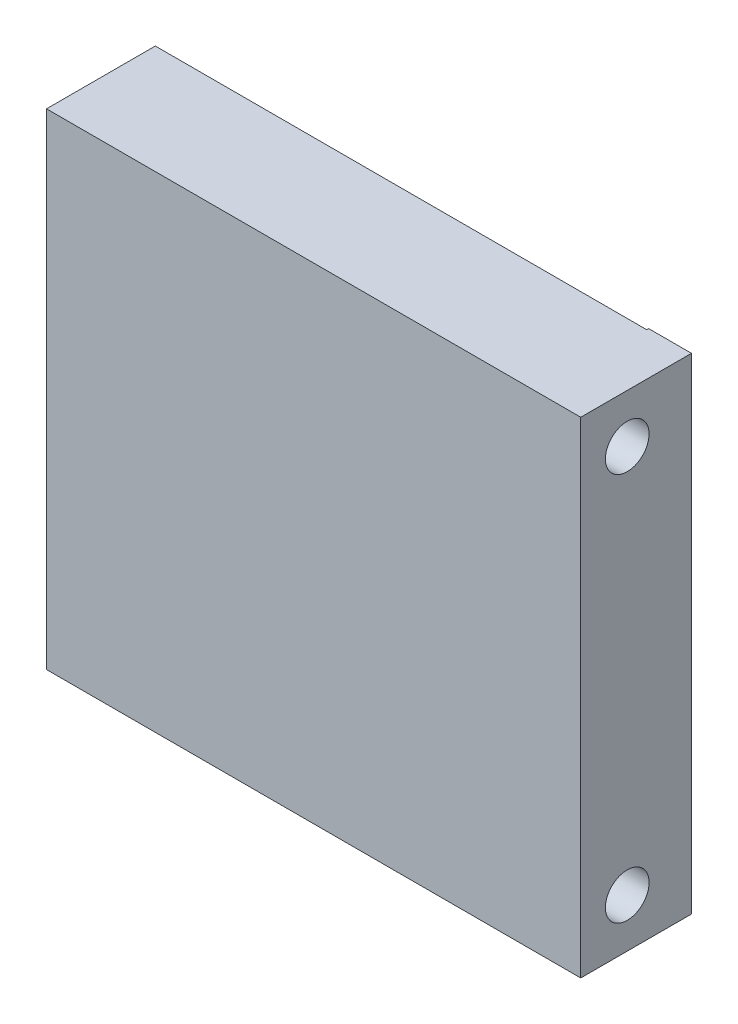
ISO-10303-21;
HEADER;
FILE_DESCRIPTION(('STEP AP214'),'2;1');
FILE_NAME('part.step','',(''),(''),'','','');
FILE_SCHEMA(('AUTOMOTIVE_DESIGN { 1 0 10303 214 1 1 1 1 }'));
ENDSEC;
DATA;
#1=APPLICATION_CONTEXT('core data for automotive mechanical design processes');
#2=APPLICATION_PROTOCOL_DEFINITION('international standard','automotive_design',2000,#1);
#3=PRODUCT_CONTEXT('',#1,'mechanical');
#4=PRODUCT('Part','Part','',(#3));
#5=PRODUCT_RELATED_PRODUCT_CATEGORY('part','',(#4));
#6=PRODUCT_DEFINITION_FORMATION('','',#4);
#7=PRODUCT_DEFINITION_CONTEXT('part definition',#1,'design');
#8=PRODUCT_DEFINITION('design','',#6,#7);
#9=PRODUCT_DEFINITION_SHAPE('','',#8);
#10=(LENGTH_UNIT() NAMED_UNIT(*) SI_UNIT(.MILLI.,.METRE.));
#11=(NAMED_UNIT(*) PLANE_ANGLE_UNIT() SI_UNIT($,.RADIAN.));
#12=(NAMED_UNIT(*) SI_UNIT($,.STERADIAN.) SOLID_ANGLE_UNIT());
#13=UNCERTAINTY_MEASURE_WITH_UNIT(LENGTH_MEASURE(1.E-05),#10,'distance_accuracy_value','');
#14=(GEOMETRIC_REPRESENTATION_CONTEXT(3) GLOBAL_UNCERTAINTY_ASSIGNED_CONTEXT((#13)) GLOBAL_UNIT_ASSIGNED_CONTEXT((#10,
#11,#12)) REPRESENTATION_CONTEXT('',''));
#15=CARTESIAN_POINT('',(0.,0.,0.));
#16=DIRECTION('',(0.,0.,1.));
#17=DIRECTION('',(1.,0.,0.));
#18=AXIS2_PLACEMENT_3D('',#15,#16,#17);
#19=CARTESIAN_POINT('',(25.3,0.,0.));
#20=DIRECTION('',(-1.,0.,0.));
#21=DIRECTION('',(0.,0.,1.));
#22=AXIS2_PLACEMENT_3D('',#19,#20,#21);
#23=PLANE('',#22);
#24=DIRECTION('',(0.,0.,1.));
#25=VECTOR('',#24,1.);
#26=CARTESIAN_POINT('',(25.3,20.5,-8.2));
#27=LINE('',#26,#25);
#28=CARTESIAN_POINT('',(25.3,20.5,-8.2));
#29=VERTEX_POINT('',#28);
#30=CARTESIAN_POINT('',(25.3,20.5,-6.4));
#31=VERTEX_POINT('',#30);
#32=EDGE_CURVE('E200',#29,#31,#27,.T.);
#33=ORIENTED_EDGE('',*,*,#32,.F.);
#34=DIRECTION('',(0.,-1.,0.));
#35=VECTOR('',#34,1.);
#36=CARTESIAN_POINT('',(25.3,19.5,-8.2));
#37=LINE('',#36,#35);
#38=CARTESIAN_POINT('',(25.3,19.5,-8.2));
#39=VERTEX_POINT('',#38);
#40=EDGE_CURVE('E11',#29,#39,#37,.T.);
#41=ORIENTED_EDGE('',*,*,#40,.T.);
#42=DIRECTION('',(0.,0.,1.));
#43=VECTOR('',#42,1.);
#44=CARTESIAN_POINT('',(25.3,19.5,-10.2));
#45=LINE('',#44,#43);
#46=CARTESIAN_POINT('',(25.3,19.5,-10.2));
#47=VERTEX_POINT('',#46);
#48=EDGE_CURVE('E198',#47,#39,#45,.T.);
#49=ORIENTED_EDGE('',*,*,#48,.F.);
#50=DIRECTION('',(0.,-1.,0.));
#51=VECTOR('',#50,1.);
#52=CARTESIAN_POINT('',(25.3,19.5,-10.2));
#53=LINE('',#52,#51);
#54=CARTESIAN_POINT('',(25.3,25.,-10.2));
#55=VERTEX_POINT('',#54);
#56=EDGE_CURVE('E194',#55,#47,#53,.T.);
#57=ORIENTED_EDGE('',*,*,#56,.F.);
#58=DIRECTION('',(0.,0.,1.));
#59=VECTOR('',#58,1.);
#60=CARTESIAN_POINT('',(25.3,25.,1.));
#61=LINE('',#60,#59);
#62=CARTESIAN_POINT('',(25.3,25.,-10.4));
#63=VERTEX_POINT('',#62);
#64=EDGE_CURVE('E284',#63,#55,#61,.T.);
#65=ORIENTED_EDGE('',*,*,#64,.F.);
#66=DIRECTION('',(0.,1.,0.));
#67=VECTOR('',#66,1.);
#68=CARTESIAN_POINT('',(25.3,25.,-10.4));
#69=LINE('',#68,#67);
#70=CARTESIAN_POINT('',(25.3,-25.,-10.4));
#71=VERTEX_POINT('',#70);
#72=EDGE_CURVE('E298',#71,#63,#69,.T.);
#73=ORIENTED_EDGE('',*,*,#72,.F.);
#74=DIRECTION('',(0.,0.,-1.));
#75=VECTOR('',#74,1.);
#76=CARTESIAN_POINT('',(25.3,-25.,1.));
#77=LINE('',#76,#75);
#78=CARTESIAN_POINT('',(25.3,-25.,-10.2));
#79=VERTEX_POINT('',#78);
#80=EDGE_CURVE('E306',#79,#71,#77,.T.);
#81=ORIENTED_EDGE('',*,*,#80,.F.);
#82=DIRECTION('',(0.,-1.,0.));
#83=VECTOR('',#82,1.);
#84=CARTESIAN_POINT('',(25.3,-25.,-10.2));
#85=LINE('',#84,#83);
#86=CARTESIAN_POINT('',(25.3,-19.5,-10.2));
#87=VERTEX_POINT('',#86);
#88=EDGE_CURVE('E219',#87,#79,#85,.T.);
#89=ORIENTED_EDGE('',*,*,#88,.F.);
#90=DIRECTION('',(0.,0.,1.));
#91=VECTOR('',#90,1.);
#92=CARTESIAN_POINT('',(25.3,-19.5,-10.2));
#93=LINE('',#92,#91);
#94=CARTESIAN_POINT('',(25.3,-19.5,-8.2));
#95=VERTEX_POINT('',#94);
#96=EDGE_CURVE('E209',#87,#95,#93,.T.);
#97=ORIENTED_EDGE('',*,*,#96,.T.);
#98=DIRECTION('',(0.,-1.,0.));
#99=VECTOR('',#98,1.);
#100=CARTESIAN_POINT('',(25.3,-25.,-8.2));
#101=LINE('',#100,#99);
#102=CARTESIAN_POINT('',(25.3,-20.5,-8.2));
#103=VERTEX_POINT('',#102);
#104=EDGE_CURVE('E65',#95,#103,#101,.T.);
#105=ORIENTED_EDGE('',*,*,#104,.T.);
#106=DIRECTION('',(0.,0.,1.));
#107=VECTOR('',#106,1.);
#108=CARTESIAN_POINT('',(25.3,-20.5,-8.2));
#109=LINE('',#108,#107);
#110=CARTESIAN_POINT('',(25.3,-20.5,-6.4));
#111=VERTEX_POINT('',#110);
#112=EDGE_CURVE('E236',#103,#111,#109,.T.);
#113=ORIENTED_EDGE('',*,*,#112,.T.);
#114=DIRECTION('',(0.,-1.,0.));
#115=VECTOR('',#114,1.);
#116=CARTESIAN_POINT('',(25.3,-25.,-6.4));
#117=LINE('',#116,#115);
#118=CARTESIAN_POINT('',(25.3,-19.5,-6.4));
#119=VERTEX_POINT('',#118);
#120=EDGE_CURVE('E267',#119,#111,#117,.T.);
#121=ORIENTED_EDGE('',*,*,#120,.F.);
#122=DIRECTION('',(0.,0.,1.));
#123=VECTOR('',#122,1.);
#124=CARTESIAN_POINT('',(25.3,-19.5,-6.4));
#125=LINE('',#124,#123);
#126=CARTESIAN_POINT('',(25.3,-19.5,-5.98088013202861));
#127=VERTEX_POINT('',#126);
#128=EDGE_CURVE('E270',#119,#127,#125,.T.);
#129=ORIENTED_EDGE('',*,*,#128,.T.);
#130=CARTESIAN_POINT('',(25.3,-20.,-3.78713903518058));
#131=DIRECTION('',(1.,0.,0.));
#132=DIRECTION('',(0.,0.,-1.));
#133=AXIS2_PLACEMENT_3D('',#130,#131,#132);
#134=CIRCLE('',#133,2.25);
#135=CARTESIAN_POINT('',(25.3,-19.5,-1.59339793833255));
#136=VERTEX_POINT('',#135);
#137=EDGE_CURVE('E280',#127,#136,#134,.T.);
#138=ORIENTED_EDGE('',*,*,#137,.T.);
#139=CARTESIAN_POINT('',(25.3,-19.5,0.));
#140=VERTEX_POINT('',#139);
#141=EDGE_CURVE('E268',#136,#140,#125,.T.);
#142=ORIENTED_EDGE('',*,*,#141,.T.);
#143=DIRECTION('',(0.,1.,0.));
#144=VECTOR('',#143,1.);
#145=CARTESIAN_POINT('',(25.3,-25.,0.));
#146=LINE('',#145,#144);
#147=CARTESIAN_POINT('',(25.3,19.5,0.));
#148=VERTEX_POINT('',#147);
#149=EDGE_CURVE('E316',#140,#148,#146,.T.);
#150=ORIENTED_EDGE('',*,*,#149,.T.);
#151=DIRECTION('',(0.,0.,1.));
#152=VECTOR('',#151,1.);
#153=CARTESIAN_POINT('',(25.3,19.5,-6.4));
#154=LINE('',#153,#152);
#155=CARTESIAN_POINT('',(25.3,19.5,-1.59339793833255));
#156=VERTEX_POINT('',#155);
#157=EDGE_CURVE('E258',#156,#148,#154,.T.);
#158=ORIENTED_EDGE('',*,*,#157,.F.);
#159=CARTESIAN_POINT('',(25.3,20.,-3.78713903518058));
#160=DIRECTION('',(1.,0.,0.));
#161=DIRECTION('',(0.,0.,-1.));
#162=AXIS2_PLACEMENT_3D('',#159,#160,#161);
#163=CIRCLE('',#162,2.25);
#164=CARTESIAN_POINT('',(25.3,19.5,-5.98088013202861));
#165=VERTEX_POINT('',#164);
#166=EDGE_CURVE('E289',#156,#165,#163,.T.);
#167=ORIENTED_EDGE('',*,*,#166,.T.);
#168=CARTESIAN_POINT('',(25.3,19.5,-6.4));
#169=VERTEX_POINT('',#168);
#170=EDGE_CURVE('E257',#169,#165,#154,.T.);
#171=ORIENTED_EDGE('',*,*,#170,.F.);
#172=DIRECTION('',(0.,-1.,0.));
#173=VECTOR('',#172,1.);
#174=CARTESIAN_POINT('',(25.3,19.5,-6.4));
#175=LINE('',#174,#173);
#176=EDGE_CURVE('E246',#31,#169,#175,.T.);
#177=ORIENTED_EDGE('',*,*,#176,.F.);
#178=EDGE_LOOP('',(#33,#41,#49,#57,#65,#73,#81,#89,#97,#105,#113,#121,#129,#138,#142,#150,#158,
#167,#171,#177));
#179=FACE_BOUND('',#178,.T.);
#180=ADVANCED_FACE('F39',(#179),#23,.T.);
#181=CARTESIAN_POINT('',(0.,0.,0.));
#182=DIRECTION('',(0.,0.,1.));
#183=DIRECTION('',(1.,0.,0.));
#184=AXIS2_PLACEMENT_3D('',#181,#182,#183);
#185=PLANE('',#184);
#186=DIRECTION('',(-1.,0.,0.));
#187=VECTOR('',#186,1.);
#188=CARTESIAN_POINT('',(-25.3,19.5,0.));
#189=LINE('',#188,#187);
#190=CARTESIAN_POINT('',(-25.3,19.5,0.));
#191=VERTEX_POINT('',#190);
#192=EDGE_CURVE('E248',#148,#191,#189,.T.);
#193=ORIENTED_EDGE('',*,*,#192,.F.);
#194=ORIENTED_EDGE('',*,*,#149,.F.);
#195=DIRECTION('',(1.,0.,0.));
#196=VECTOR('',#195,1.);
#197=CARTESIAN_POINT('',(-25.3,-19.5,0.));
#198=LINE('',#197,#196);
#199=CARTESIAN_POINT('',(-25.3,-19.5,0.));
#200=VERTEX_POINT('',#199);
#201=EDGE_CURVE('E259',#200,#140,#198,.T.);
#202=ORIENTED_EDGE('',*,*,#201,.F.);
#203=DIRECTION('',(0.,-1.,0.));
#204=VECTOR('',#203,1.);
#205=CARTESIAN_POINT('',(-25.3,-25.,0.));
#206=LINE('',#205,#204);
#207=EDGE_CURVE('E313',#191,#200,#206,.T.);
#208=ORIENTED_EDGE('',*,*,#207,.F.);
#209=EDGE_LOOP('',(#193,#194,#202,#208));
#210=FACE_BOUND('',#209,.T.);
#211=ADVANCED_FACE('F383',(#210),#185,.F.);
#212=CARTESIAN_POINT('',(-25.3,25.,1.));
#213=DIRECTION('',(0.,-1.,0.));
#214=DIRECTION('',(1.,0.,0.));
#215=AXIS2_PLACEMENT_3D('',#212,#213,#214);
#216=PLANE('',#215);
#217=DIRECTION('',(1.,0.,0.));
#218=VECTOR('',#217,1.);
#219=CARTESIAN_POINT('',(-25.3,25.,-10.2));
#220=LINE('',#219,#218);
#221=CARTESIAN_POINT('',(-25.3,25.,-10.2));
#222=VERTEX_POINT('',#221);
#223=EDGE_CURVE('E190',#222,#55,#220,.T.);
#224=ORIENTED_EDGE('',*,*,#223,.F.);
#225=DIRECTION('',(0.,0.,-1.));
#226=VECTOR('',#225,1.);
#227=CARTESIAN_POINT('',(-25.3,25.,1.));
#228=LINE('',#227,#226);
#229=CARTESIAN_POINT('',(-25.3,25.,1.));
#230=VERTEX_POINT('',#229);
#231=EDGE_CURVE('E43',#230,#222,#228,.T.);
#232=ORIENTED_EDGE('',*,*,#231,.F.);
#233=DIRECTION('',(-1.,0.,0.));
#234=VECTOR('',#233,1.);
#235=CARTESIAN_POINT('',(-25.3,25.,1.));
#236=LINE('',#235,#234);
#237=CARTESIAN_POINT('',(29.7,25.,1.));
#238=VERTEX_POINT('',#237);
#239=EDGE_CURVE('E314',#238,#230,#236,.T.);
#240=ORIENTED_EDGE('',*,*,#239,.F.);
#241=DIRECTION('',(0.,0.,1.));
#242=VECTOR('',#241,1.);
#243=CARTESIAN_POINT('',(29.7,25.,1.));
#244=LINE('',#243,#242);
#245=CARTESIAN_POINT('',(29.7,25.,-10.4));
#246=VERTEX_POINT('',#245);
#247=EDGE_CURVE('E292',#246,#238,#244,.T.);
#248=ORIENTED_EDGE('',*,*,#247,.F.);
#249=DIRECTION('',(-1.,0.,0.));
#250=VECTOR('',#249,1.);
#251=CARTESIAN_POINT('',(29.7,25.,-10.4));
#252=LINE('',#251,#250);
#253=EDGE_CURVE('E303',#246,#63,#252,.T.);
#254=ORIENTED_EDGE('',*,*,#253,.T.);
#255=ORIENTED_EDGE('',*,*,#64,.T.);
#256=EDGE_LOOP('',(#224,#232,#240,#248,#254,#255));
#257=FACE_BOUND('',#256,.T.);
#258=ADVANCED_FACE('F41',(#257),#216,.F.);
#259=CARTESIAN_POINT('',(-25.3,-25.,1.));
#260=DIRECTION('',(1.,0.,0.));
#261=DIRECTION('',(0.,0.,-1.));
#262=AXIS2_PLACEMENT_3D('',#259,#260,#261);
#263=PLANE('',#262);
#264=ORIENTED_EDGE('',*,*,#231,.T.);
#265=DIRECTION('',(0.,1.,0.));
#266=VECTOR('',#265,1.);
#267=CARTESIAN_POINT('',(-25.3,19.5,-10.2));
#268=LINE('',#267,#266);
#269=CARTESIAN_POINT('',(-25.3,19.5,-10.2));
#270=VERTEX_POINT('',#269);
#271=EDGE_CURVE('E177',#270,#222,#268,.T.);
#272=ORIENTED_EDGE('',*,*,#271,.F.);
#273=DIRECTION('',(0.,0.,1.));
#274=VECTOR('',#273,1.);
#275=CARTESIAN_POINT('',(-25.3,19.5,-10.2));
#276=LINE('',#275,#274);
#277=CARTESIAN_POINT('',(-25.3,19.5,-8.2));
#278=VERTEX_POINT('',#277);
#279=EDGE_CURVE('E185',#270,#278,#276,.T.);
#280=ORIENTED_EDGE('',*,*,#279,.T.);
#281=DIRECTION('',(0.,1.,0.));
#282=VECTOR('',#281,1.);
#283=CARTESIAN_POINT('',(-25.3,19.5,-8.2));
#284=LINE('',#283,#282);
#285=CARTESIAN_POINT('',(-25.3,20.5,-8.2));
#286=VERTEX_POINT('',#285);
#287=EDGE_CURVE('E195',#278,#286,#284,.T.);
#288=ORIENTED_EDGE('',*,*,#287,.T.);
#289=DIRECTION('',(0.,0.,1.));
#290=VECTOR('',#289,1.);
#291=CARTESIAN_POINT('',(-25.3,20.5,-8.2));
#292=LINE('',#291,#290);
#293=CARTESIAN_POINT('',(-25.3,20.5,-6.4));
#294=VERTEX_POINT('',#293);
#295=EDGE_CURVE('E205',#286,#294,#292,.T.);
#296=ORIENTED_EDGE('',*,*,#295,.T.);
#297=DIRECTION('',(0.,1.,0.));
#298=VECTOR('',#297,1.);
#299=CARTESIAN_POINT('',(-25.3,19.5,-6.4));
#300=LINE('',#299,#298);
#301=CARTESIAN_POINT('',(-25.3,19.5,-6.4));
#302=VERTEX_POINT('',#301);
#303=EDGE_CURVE('E252',#302,#294,#300,.T.);
#304=ORIENTED_EDGE('',*,*,#303,.F.);
#305=DIRECTION('',(0.,0.,1.));
#306=VECTOR('',#305,1.);
#307=CARTESIAN_POINT('',(-25.3,19.5,-6.4));
#308=LINE('',#307,#306);
#309=EDGE_CURVE('E254',#302,#191,#308,.T.);
#310=ORIENTED_EDGE('',*,*,#309,.T.);
#311=ORIENTED_EDGE('',*,*,#207,.T.);
#312=DIRECTION('',(0.,0.,1.));
#313=VECTOR('',#312,1.);
#314=CARTESIAN_POINT('',(-25.3,-19.5,-6.4));
#315=LINE('',#314,#313);
#316=CARTESIAN_POINT('',(-25.3,-19.5,-6.4));
#317=VERTEX_POINT('',#316);
#318=EDGE_CURVE('E238',#317,#200,#315,.T.);
#319=ORIENTED_EDGE('',*,*,#318,.F.);
#320=DIRECTION('',(0.,1.,0.));
#321=VECTOR('',#320,1.);
#322=CARTESIAN_POINT('',(-25.3,-25.,-6.4));
#323=LINE('',#322,#321);
#324=CARTESIAN_POINT('',(-25.3,-20.5,-6.4));
#325=VERTEX_POINT('',#324);
#326=EDGE_CURVE('E271',#325,#317,#323,.T.);
#327=ORIENTED_EDGE('',*,*,#326,.F.);
#328=DIRECTION('',(0.,0.,1.));
#329=VECTOR('',#328,1.);
#330=CARTESIAN_POINT('',(-25.3,-20.5,-8.2));
#331=LINE('',#330,#329);
#332=CARTESIAN_POINT('',(-25.3,-20.5,-8.2));
#333=VERTEX_POINT('',#332);
#334=EDGE_CURVE('E230',#333,#325,#331,.T.);
#335=ORIENTED_EDGE('',*,*,#334,.F.);
#336=DIRECTION('',(0.,1.,0.));
#337=VECTOR('',#336,1.);
#338=CARTESIAN_POINT('',(-25.3,-25.,-8.2));
#339=LINE('',#338,#337);
#340=CARTESIAN_POINT('',(-25.3,-19.5,-8.2));
#341=VERTEX_POINT('',#340);
#342=EDGE_CURVE('E212',#333,#341,#339,.T.);
#343=ORIENTED_EDGE('',*,*,#342,.T.);
#344=DIRECTION('',(0.,0.,1.));
#345=VECTOR('',#344,1.);
#346=CARTESIAN_POINT('',(-25.3,-19.5,-10.2));
#347=LINE('',#346,#345);
#348=CARTESIAN_POINT('',(-25.3,-19.5,-10.2));
#349=VERTEX_POINT('',#348);
#350=EDGE_CURVE('E207',#349,#341,#347,.T.);
#351=ORIENTED_EDGE('',*,*,#350,.F.);
#352=DIRECTION('',(0.,1.,0.));
#353=VECTOR('',#352,1.);
#354=CARTESIAN_POINT('',(-25.3,-25.,-10.2));
#355=LINE('',#354,#353);
#356=CARTESIAN_POINT('',(-25.3,-25.,-10.2));
#357=VERTEX_POINT('',#356);
#358=EDGE_CURVE('E217',#357,#349,#355,.T.);
#359=ORIENTED_EDGE('',*,*,#358,.F.);
#360=DIRECTION('',(0.,0.,-1.));
#361=VECTOR('',#360,1.);
#362=CARTESIAN_POINT('',(-25.3,-25.,1.));
#363=LINE('',#362,#361);
#364=CARTESIAN_POINT('',(-25.3,-25.,1.));
#365=VERTEX_POINT('',#364);
#366=EDGE_CURVE('E325',#365,#357,#363,.T.);
#367=ORIENTED_EDGE('',*,*,#366,.F.);
#368=DIRECTION('',(0.,-1.,0.));
#369=VECTOR('',#368,1.);
#370=CARTESIAN_POINT('',(-25.3,19.,1.));
#371=LINE('',#370,#369);
#372=EDGE_CURVE('E319',#230,#365,#371,.T.);
#373=ORIENTED_EDGE('',*,*,#372,.F.);
#374=EDGE_LOOP('',(#264,#272,#280,#288,#296,#304,#310,#311,#319,#327,#335,#343,#351,#359,#367,#373));
#375=FACE_BOUND('',#374,.T.);
#376=ADVANCED_FACE('F179',(#375),#263,.F.);
#377=CARTESIAN_POINT('',(-25.3,-25.,1.));
#378=DIRECTION('',(0.,1.,0.));
#379=DIRECTION('',(-1.,0.,0.));
#380=AXIS2_PLACEMENT_3D('',#377,#378,#379);
#381=PLANE('',#380);
#382=ORIENTED_EDGE('',*,*,#366,.T.);
#383=DIRECTION('',(-1.,0.,0.));
#384=VECTOR('',#383,1.);
#385=CARTESIAN_POINT('',(-25.3,-25.,-10.2));
#386=LINE('',#385,#384);
#387=EDGE_CURVE('E225',#79,#357,#386,.T.);
#388=ORIENTED_EDGE('',*,*,#387,.F.);
#389=ORIENTED_EDGE('',*,*,#80,.T.);
#390=DIRECTION('',(-1.,0.,0.));
#391=VECTOR('',#390,1.);
#392=CARTESIAN_POINT('',(29.7,-25.,-10.4));
#393=LINE('',#392,#391);
#394=CARTESIAN_POINT('',(29.7,-25.,-10.4));
#395=VERTEX_POINT('',#394);
#396=EDGE_CURVE('E311',#395,#71,#393,.T.);
#397=ORIENTED_EDGE('',*,*,#396,.F.);
#398=DIRECTION('',(0.,0.,-1.));
#399=VECTOR('',#398,1.);
#400=CARTESIAN_POINT('',(29.7,-25.,1.));
#401=LINE('',#400,#399);
#402=CARTESIAN_POINT('',(29.7,-25.,1.));
#403=VERTEX_POINT('',#402);
#404=EDGE_CURVE('E299',#403,#395,#401,.T.);
#405=ORIENTED_EDGE('',*,*,#404,.F.);
#406=DIRECTION('',(1.,0.,0.));
#407=VECTOR('',#406,1.);
#408=CARTESIAN_POINT('',(-25.3,-25.,1.));
#409=LINE('',#408,#407);
#410=EDGE_CURVE('E324',#365,#403,#409,.T.);
#411=ORIENTED_EDGE('',*,*,#410,.F.);
#412=EDGE_LOOP('',(#382,#388,#389,#397,#405,#411));
#413=FACE_BOUND('',#412,.T.);
#414=ADVANCED_FACE('F327',(#413),#381,.F.);
#415=CARTESIAN_POINT('',(0.,0.,1.));
#416=DIRECTION('',(0.,0.,1.));
#417=DIRECTION('',(1.,0.,0.));
#418=AXIS2_PLACEMENT_3D('',#415,#416,#417);
#419=PLANE('',#418);
#420=ORIENTED_EDGE('',*,*,#239,.T.);
#421=ORIENTED_EDGE('',*,*,#372,.T.);
#422=ORIENTED_EDGE('',*,*,#410,.T.);
#423=DIRECTION('',(0.,-1.,0.));
#424=VECTOR('',#423,1.);
#425=CARTESIAN_POINT('',(29.7,25.,1.));
#426=LINE('',#425,#424);
#427=EDGE_CURVE('E294',#238,#403,#426,.T.);
#428=ORIENTED_EDGE('',*,*,#427,.F.);
#429=EDGE_LOOP('',(#420,#421,#422,#428));
#430=FACE_BOUND('',#429,.T.);
#431=ADVANCED_FACE('F357',(#430),#419,.T.);
#432=CARTESIAN_POINT('',(29.7,25.,-10.4));
#433=DIRECTION('',(0.,0.,1.));
#434=DIRECTION('',(0.,-1.,0.));
#435=AXIS2_PLACEMENT_3D('',#432,#433,#434);
#436=PLANE('',#435);
#437=ORIENTED_EDGE('',*,*,#72,.T.);
#438=ORIENTED_EDGE('',*,*,#253,.F.);
#439=DIRECTION('',(0.,1.,0.));
#440=VECTOR('',#439,1.);
#441=CARTESIAN_POINT('',(29.7,25.,-10.4));
#442=LINE('',#441,#440);
#443=EDGE_CURVE('E301',#395,#246,#442,.T.);
#444=ORIENTED_EDGE('',*,*,#443,.F.);
#445=ORIENTED_EDGE('',*,*,#396,.T.);
#446=EDGE_LOOP('',(#437,#438,#444,#445));
#447=FACE_BOUND('',#446,.T.);
#448=ADVANCED_FACE('F347',(#447),#436,.F.);
#449=CARTESIAN_POINT('',(29.7,0.,0.));
#450=DIRECTION('',(-1.,0.,0.));
#451=DIRECTION('',(0.,0.,1.));
#452=AXIS2_PLACEMENT_3D('',#449,#450,#451);
#453=PLANE('',#452);
#454=CARTESIAN_POINT('',(29.7,-20.,-3.78713903518058));
#455=DIRECTION('',(1.,0.,0.));
#456=DIRECTION('',(0.,0.,-1.));
#457=AXIS2_PLACEMENT_3D('',#454,#455,#456);
#458=CIRCLE('',#457,2.25);
#459=CARTESIAN_POINT('',(29.7,-20.,-6.03713903518058));
#460=VERTEX_POINT('',#459);
#461=EDGE_CURVE('E285',#460,#460,#458,.T.);
#462=ORIENTED_EDGE('',*,*,#461,.F.);
#463=EDGE_LOOP('',(#462));
#464=FACE_BOUND('',#463,.T.);
#465=CARTESIAN_POINT('',(29.7,20.,-3.78713903518058));
#466=DIRECTION('',(1.,0.,0.));
#467=DIRECTION('',(0.,0.,-1.));
#468=AXIS2_PLACEMENT_3D('',#465,#466,#467);
#469=CIRCLE('',#468,2.25);
#470=CARTESIAN_POINT('',(29.7,20.,-6.03713903518058));
#471=VERTEX_POINT('',#470);
#472=EDGE_CURVE('E288',#471,#471,#469,.T.);
#473=ORIENTED_EDGE('',*,*,#472,.F.);
#474=EDGE_LOOP('',(#473));
#475=FACE_BOUND('',#474,.T.);
#476=ORIENTED_EDGE('',*,*,#247,.T.);
#477=ORIENTED_EDGE('',*,*,#427,.T.);
#478=ORIENTED_EDGE('',*,*,#404,.T.);
#479=ORIENTED_EDGE('',*,*,#443,.T.);
#480=EDGE_LOOP('',(#476,#477,#478,#479));
#481=FACE_BOUND('',#480,.T.);
#482=ADVANCED_FACE('F354',(#464,#475,#481),#453,.F.);
#483=CARTESIAN_POINT('',(25.3,20.,-3.78713903518058));
#484=DIRECTION('',(1.,0.,0.));
#485=DIRECTION('',(0.,0.,-1.));
#486=AXIS2_PLACEMENT_3D('',#483,#484,#485);
#487=CYLINDRICAL_SURFACE('',#486,2.25);
#488=ORIENTED_EDGE('',*,*,#166,.F.);
#489=EDGE_CURVE('E265',#165,#156,#163,.T.);
#490=ORIENTED_EDGE('',*,*,#489,.F.);
#491=EDGE_LOOP('',(#488,#490));
#492=FACE_BOUND('',#491,.T.);
#493=ORIENTED_EDGE('',*,*,#472,.T.);
#494=EDGE_LOOP('',(#493));
#495=FACE_BOUND('',#494,.T.);
#496=ADVANCED_FACE('F405',(#492,#495),#487,.F.);
#497=CARTESIAN_POINT('',(25.3,-20.,-3.78713903518058));
#498=DIRECTION('',(1.,0.,0.));
#499=DIRECTION('',(0.,0.,-1.));
#500=AXIS2_PLACEMENT_3D('',#497,#498,#499);
#501=CYLINDRICAL_SURFACE('',#500,2.25);
#502=ORIENTED_EDGE('',*,*,#137,.F.);
#503=EDGE_CURVE('E281',#136,#127,#134,.T.);
#504=ORIENTED_EDGE('',*,*,#503,.F.);
#505=EDGE_LOOP('',(#502,#504));
#506=FACE_BOUND('',#505,.T.);
#507=ORIENTED_EDGE('',*,*,#461,.T.);
#508=EDGE_LOOP('',(#507));
#509=FACE_BOUND('',#508,.T.);
#510=ADVANCED_FACE('F399',(#506,#509),#501,.F.);
#511=CARTESIAN_POINT('',(25.3,-25.,-6.4));
#512=DIRECTION('',(-1.,0.,0.));
#513=DIRECTION('',(0.,0.,1.));
#514=AXIS2_PLACEMENT_3D('',#511,#512,#513);
#515=PLANE('',#514);
#516=EDGE_CURVE('E272',#127,#136,#125,.T.);
#517=ORIENTED_EDGE('',*,*,#516,.T.);
#518=ORIENTED_EDGE('',*,*,#503,.T.);
#519=EDGE_LOOP('',(#517,#518));
#520=FACE_BOUND('',#519,.T.);
#521=ADVANCED_FACE('F398',(#520),#515,.F.);
#522=CARTESIAN_POINT('',(-25.3,-19.5,-6.4));
#523=DIRECTION('',(0.,-1.,0.));
#524=DIRECTION('',(0.,0.,-1.));
#525=AXIS2_PLACEMENT_3D('',#522,#523,#524);
#526=PLANE('',#525);
#527=ORIENTED_EDGE('',*,*,#201,.T.);
#528=ORIENTED_EDGE('',*,*,#141,.F.);
#529=ORIENTED_EDGE('',*,*,#516,.F.);
#530=ORIENTED_EDGE('',*,*,#128,.F.);
#531=DIRECTION('',(1.,0.,0.));
#532=VECTOR('',#531,1.);
#533=CARTESIAN_POINT('',(-25.3,-19.5,-6.4));
#534=LINE('',#533,#532);
#535=EDGE_CURVE('E273',#317,#119,#534,.T.);
#536=ORIENTED_EDGE('',*,*,#535,.F.);
#537=ORIENTED_EDGE('',*,*,#318,.T.);
#538=EDGE_LOOP('',(#527,#528,#529,#530,#536,#537));
#539=FACE_BOUND('',#538,.T.);
#540=ADVANCED_FACE('F388',(#539),#526,.F.);
#541=CARTESIAN_POINT('',(0.,0.,-6.4));
#542=DIRECTION('',(0.,0.,-1.));
#543=DIRECTION('',(-1.,0.,0.));
#544=AXIS2_PLACEMENT_3D('',#541,#542,#543);
#545=PLANE('',#544);
#546=DIRECTION('',(1.,0.,0.));
#547=VECTOR('',#546,1.);
#548=CARTESIAN_POINT('',(25.3,-20.5,-6.4));
#549=LINE('',#548,#547);
#550=EDGE_CURVE('E229',#325,#111,#549,.T.);
#551=ORIENTED_EDGE('',*,*,#550,.F.);
#552=ORIENTED_EDGE('',*,*,#326,.T.);
#553=ORIENTED_EDGE('',*,*,#535,.T.);
#554=ORIENTED_EDGE('',*,*,#120,.T.);
#555=EDGE_LOOP('',(#551,#552,#553,#554));
#556=FACE_BOUND('',#555,.T.);
#557=ADVANCED_FACE('F530',(#556),#545,.T.);
#558=CARTESIAN_POINT('',(25.3,19.5,-6.4));
#559=DIRECTION('',(-1.,0.,0.));
#560=DIRECTION('',(0.,0.,1.));
#561=AXIS2_PLACEMENT_3D('',#558,#559,#560);
#562=PLANE('',#561);
#563=EDGE_CURVE('E263',#165,#156,#154,.T.);
#564=ORIENTED_EDGE('',*,*,#563,.F.);
#565=ORIENTED_EDGE('',*,*,#489,.T.);
#566=EDGE_LOOP('',(#564,#565));
#567=FACE_BOUND('',#566,.T.);
#568=ADVANCED_FACE('F523',(#567),#562,.F.);
#569=CARTESIAN_POINT('',(-25.3,19.5,-6.4));
#570=DIRECTION('',(0.,1.,0.));
#571=DIRECTION('',(0.,0.,1.));
#572=AXIS2_PLACEMENT_3D('',#569,#570,#571);
#573=PLANE('',#572);
#574=ORIENTED_EDGE('',*,*,#192,.T.);
#575=ORIENTED_EDGE('',*,*,#309,.F.);
#576=DIRECTION('',(-1.,0.,0.));
#577=VECTOR('',#576,1.);
#578=CARTESIAN_POINT('',(-25.3,19.5,-6.4));
#579=LINE('',#578,#577);
#580=EDGE_CURVE('E247',#169,#302,#579,.T.);
#581=ORIENTED_EDGE('',*,*,#580,.F.);
#582=ORIENTED_EDGE('',*,*,#170,.T.);
#583=ORIENTED_EDGE('',*,*,#563,.T.);
#584=ORIENTED_EDGE('',*,*,#157,.T.);
#585=EDGE_LOOP('',(#574,#575,#581,#582,#583,#584));
#586=FACE_BOUND('',#585,.T.);
#587=ADVANCED_FACE('F378',(#586),#573,.F.);
#588=CARTESIAN_POINT('',(0.,0.,-6.4));
#589=DIRECTION('',(0.,0.,-1.));
#590=DIRECTION('',(-1.,0.,0.));
#591=AXIS2_PLACEMENT_3D('',#588,#589,#590);
#592=PLANE('',#591);
#593=DIRECTION('',(-1.,0.,0.));
#594=VECTOR('',#593,1.);
#595=CARTESIAN_POINT('',(25.3,20.5,-6.4));
#596=LINE('',#595,#594);
#597=EDGE_CURVE('E231',#31,#294,#596,.T.);
#598=ORIENTED_EDGE('',*,*,#597,.F.);
#599=ORIENTED_EDGE('',*,*,#176,.T.);
#600=ORIENTED_EDGE('',*,*,#580,.T.);
#601=ORIENTED_EDGE('',*,*,#303,.T.);
#602=EDGE_LOOP('',(#598,#599,#600,#601));
#603=FACE_BOUND('',#602,.T.);
#604=ADVANCED_FACE('F371',(#603),#592,.T.);
#605=CARTESIAN_POINT('',(25.3,20.5,-8.2));
#606=DIRECTION('',(0.,1.,0.));
#607=DIRECTION('',(-1.,0.,0.));
#608=AXIS2_PLACEMENT_3D('',#605,#606,#607);
#609=PLANE('',#608);
#610=ORIENTED_EDGE('',*,*,#597,.T.);
#611=ORIENTED_EDGE('',*,*,#295,.F.);
#612=DIRECTION('',(-1.,0.,0.));
#613=VECTOR('',#612,1.);
#614=CARTESIAN_POINT('',(25.3,20.5,-8.2));
#615=LINE('',#614,#613);
#616=EDGE_CURVE('E245',#29,#286,#615,.T.);
#617=ORIENTED_EDGE('',*,*,#616,.F.);
#618=ORIENTED_EDGE('',*,*,#32,.T.);
#619=EDGE_LOOP('',(#610,#611,#617,#618));
#620=FACE_BOUND('',#619,.T.);
#621=ADVANCED_FACE('F368',(#620),#609,.F.);
#622=CARTESIAN_POINT('',(25.3,-20.5,-8.2));
#623=DIRECTION('',(0.,-1.,0.));
#624=DIRECTION('',(1.,0.,0.));
#625=AXIS2_PLACEMENT_3D('',#622,#623,#624);
#626=PLANE('',#625);
#627=ORIENTED_EDGE('',*,*,#550,.T.);
#628=ORIENTED_EDGE('',*,*,#112,.F.);
#629=DIRECTION('',(1.,0.,0.));
#630=VECTOR('',#629,1.);
#631=CARTESIAN_POINT('',(25.3,-20.5,-8.2));
#632=LINE('',#631,#630);
#633=EDGE_CURVE('E227',#333,#103,#632,.T.);
#634=ORIENTED_EDGE('',*,*,#633,.F.);
#635=ORIENTED_EDGE('',*,*,#334,.T.);
#636=EDGE_LOOP('',(#627,#628,#634,#635));
#637=FACE_BOUND('',#636,.T.);
#638=ADVANCED_FACE('F474',(#637),#626,.F.);
#639=CARTESIAN_POINT('',(25.3,-19.5,-10.2));
#640=DIRECTION('',(0.,-1.,0.));
#641=DIRECTION('',(1.,0.,0.));
#642=AXIS2_PLACEMENT_3D('',#639,#640,#641);
#643=PLANE('',#642);
#644=DIRECTION('',(1.,0.,0.));
#645=VECTOR('',#644,1.);
#646=CARTESIAN_POINT('',(25.3,-19.5,-8.2));
#647=LINE('',#646,#645);
#648=EDGE_CURVE('E215',#341,#95,#647,.T.);
#649=ORIENTED_EDGE('',*,*,#648,.T.);
#650=ORIENTED_EDGE('',*,*,#96,.F.);
#651=DIRECTION('',(1.,0.,0.));
#652=VECTOR('',#651,1.);
#653=CARTESIAN_POINT('',(25.3,-19.5,-10.2));
#654=LINE('',#653,#652);
#655=EDGE_CURVE('E211',#349,#87,#654,.T.);
#656=ORIENTED_EDGE('',*,*,#655,.F.);
#657=ORIENTED_EDGE('',*,*,#350,.T.);
#658=EDGE_LOOP('',(#649,#650,#656,#657));
#659=FACE_BOUND('',#658,.T.);
#660=ADVANCED_FACE('F341',(#659),#643,.F.);
#661=CARTESIAN_POINT('',(0.,0.,-10.2));
#662=DIRECTION('',(0.,0.,1.));
#663=DIRECTION('',(1.,0.,0.));
#664=AXIS2_PLACEMENT_3D('',#661,#662,#663);
#665=PLANE('',#664);
#666=ORIENTED_EDGE('',*,*,#88,.T.);
#667=ORIENTED_EDGE('',*,*,#387,.T.);
#668=ORIENTED_EDGE('',*,*,#358,.T.);
#669=ORIENTED_EDGE('',*,*,#655,.T.);
#670=EDGE_LOOP('',(#666,#667,#668,#669));
#671=FACE_BOUND('',#670,.T.);
#672=ADVANCED_FACE('F334',(#671),#665,.F.);
#673=CARTESIAN_POINT('',(0.,0.,-8.2));
#674=DIRECTION('',(0.,0.,1.));
#675=DIRECTION('',(1.,0.,0.));
#676=AXIS2_PLACEMENT_3D('',#673,#674,#675);
#677=PLANE('',#676);
#678=ORIENTED_EDGE('',*,*,#342,.F.);
#679=ORIENTED_EDGE('',*,*,#633,.T.);
#680=ORIENTED_EDGE('',*,*,#104,.F.);
#681=ORIENTED_EDGE('',*,*,#648,.F.);
#682=EDGE_LOOP('',(#678,#679,#680,#681));
#683=FACE_BOUND('',#682,.T.);
#684=ADVANCED_FACE('F483',(#683),#677,.T.);
#685=CARTESIAN_POINT('',(0.,0.,-8.2));
#686=DIRECTION('',(0.,0.,-1.));
#687=DIRECTION('',(-1.,0.,0.));
#688=AXIS2_PLACEMENT_3D('',#685,#686,#687);
#689=PLANE('',#688);
#690=ORIENTED_EDGE('',*,*,#40,.F.);
#691=ORIENTED_EDGE('',*,*,#616,.T.);
#692=ORIENTED_EDGE('',*,*,#287,.F.);
#693=DIRECTION('',(-1.,0.,0.));
#694=VECTOR('',#693,1.);
#695=CARTESIAN_POINT('',(25.3,19.5,-8.2));
#696=LINE('',#695,#694);
#697=EDGE_CURVE('E196',#39,#278,#696,.T.);
#698=ORIENTED_EDGE('',*,*,#697,.F.);
#699=EDGE_LOOP('',(#690,#691,#692,#698));
#700=FACE_BOUND('',#699,.T.);
#701=ADVANCED_FACE('F489',(#700),#689,.F.);
#702=CARTESIAN_POINT('',(25.3,19.5,-10.2));
#703=DIRECTION('',(0.,1.,0.));
#704=DIRECTION('',(-1.,0.,0.));
#705=AXIS2_PLACEMENT_3D('',#702,#703,#704);
#706=PLANE('',#705);
#707=ORIENTED_EDGE('',*,*,#697,.T.);
#708=ORIENTED_EDGE('',*,*,#279,.F.);
#709=DIRECTION('',(-1.,0.,0.));
#710=VECTOR('',#709,1.);
#711=CARTESIAN_POINT('',(25.3,19.5,-10.2));
#712=LINE('',#711,#710);
#713=EDGE_CURVE('E54',#47,#270,#712,.T.);
#714=ORIENTED_EDGE('',*,*,#713,.F.);
#715=ORIENTED_EDGE('',*,*,#48,.T.);
#716=EDGE_LOOP('',(#707,#708,#714,#715));
#717=FACE_BOUND('',#716,.T.);
#718=ADVANCED_FACE('F192',(#717),#706,.F.);
#719=CARTESIAN_POINT('',(0.,0.,-10.2));
#720=DIRECTION('',(0.,0.,-1.));
#721=DIRECTION('',(-1.,0.,0.));
#722=AXIS2_PLACEMENT_3D('',#719,#720,#721);
#723=PLANE('',#722);
#724=ORIENTED_EDGE('',*,*,#713,.T.);
#725=ORIENTED_EDGE('',*,*,#271,.T.);
#726=ORIENTED_EDGE('',*,*,#223,.T.);
#727=ORIENTED_EDGE('',*,*,#56,.T.);
#728=EDGE_LOOP('',(#724,#725,#726,#727));
#729=FACE_BOUND('',#728,.T.);
#730=ADVANCED_FACE('F186',(#729),#723,.T.);
#731=CLOSED_SHELL('',(#180,#211,#258,#376,#414,#431,#448,#482,#496,#510,#521,#540,#557,#568,
#587,#604,#621,#638,#660,#672,#684,#701,#718,#730));
#732=MANIFOLD_SOLID_BREP('B2',#731);
#733=ADVANCED_BREP_SHAPE_REPRESENTATION('',(#18,#732),#14);
#734=SHAPE_DEFINITION_REPRESENTATION(#9,#733);
ENDSEC;
END-ISO-10303-21;
